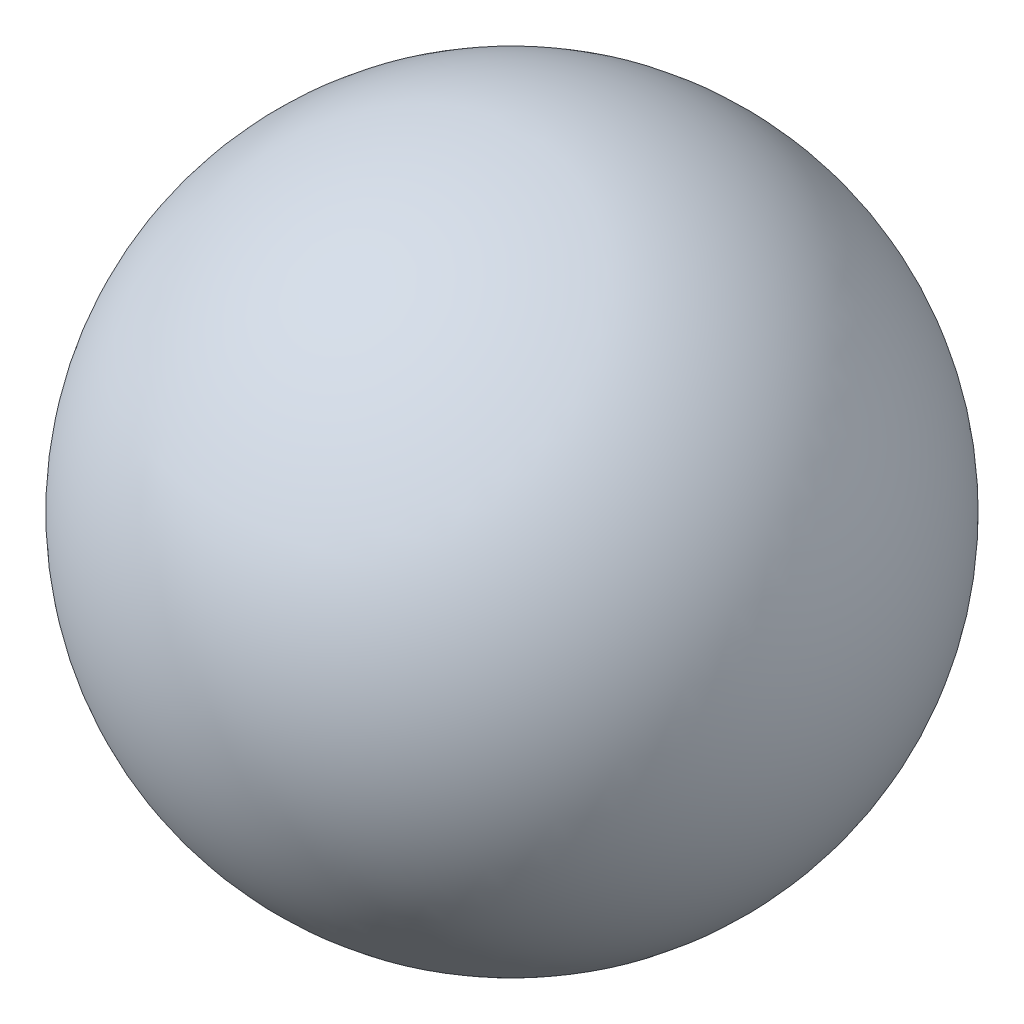
ISO-10303-21;
HEADER;
FILE_DESCRIPTION(('STEP AP214'),'2;1');
FILE_NAME('part.step','',(''),(''),'','','');
FILE_SCHEMA(('AUTOMOTIVE_DESIGN { 1 0 10303 214 1 1 1 1 }'));
ENDSEC;
DATA;
#1=APPLICATION_CONTEXT('core data for automotive mechanical design processes');
#2=APPLICATION_PROTOCOL_DEFINITION('international standard','automotive_design',2000,#1);
#3=PRODUCT_CONTEXT('',#1,'mechanical');
#4=PRODUCT('Part','Part','',(#3));
#5=PRODUCT_RELATED_PRODUCT_CATEGORY('part','',(#4));
#6=PRODUCT_DEFINITION_FORMATION('','',#4);
#7=PRODUCT_DEFINITION_CONTEXT('part definition',#1,'design');
#8=PRODUCT_DEFINITION('design','',#6,#7);
#9=PRODUCT_DEFINITION_SHAPE('','',#8);
#10=(LENGTH_UNIT() NAMED_UNIT(*) SI_UNIT(.MILLI.,.METRE.));
#11=(NAMED_UNIT(*) PLANE_ANGLE_UNIT() SI_UNIT($,.RADIAN.));
#12=(NAMED_UNIT(*) SI_UNIT($,.STERADIAN.) SOLID_ANGLE_UNIT());
#13=UNCERTAINTY_MEASURE_WITH_UNIT(LENGTH_MEASURE(1.E-05),#10,'distance_accuracy_value','');
#14=(GEOMETRIC_REPRESENTATION_CONTEXT(3) GLOBAL_UNCERTAINTY_ASSIGNED_CONTEXT((#13)) GLOBAL_UNIT_ASSIGNED_CONTEXT((#10,
#11,#12)) REPRESENTATION_CONTEXT('',''));
#15=CARTESIAN_POINT('',(0.,0.,0.));
#16=DIRECTION('',(0.,0.,1.));
#17=DIRECTION('',(1.,0.,0.));
#18=AXIS2_PLACEMENT_3D('',#15,#16,#17);
#19=CARTESIAN_POINT('',(69.1749697750399,39.854530462748,2.11749564475551));
#20=DIRECTION('',(0.,-1.,0.));
#21=DIRECTION('',(-1.,0.,0.));
#22=AXIS2_PLACEMENT_3D('',#19,#20,#21);
#23=SPHERICAL_SURFACE('',#22,0.1397);
#24=CARTESIAN_POINT('',(69.1749697750399,39.994230462748,2.11749564475551));
#25=VERTEX_POINT('',#24);
#26=VERTEX_LOOP('',#25);
#27=FACE_BOUND('',#26,.T.);
#28=CARTESIAN_POINT('',(69.1749697750399,39.714830462748,2.11749564475551));
#29=VERTEX_POINT('',#28);
#30=VERTEX_LOOP('',#29);
#31=FACE_BOUND('',#30,.T.);
#32=ADVANCED_FACE('F16',(#27,#31),#23,.T.);
#33=CLOSED_SHELL('',(#32));
#34=MANIFOLD_SOLID_BREP('B1',#33);
#35=ADVANCED_BREP_SHAPE_REPRESENTATION('',(#18,#34),#14);
#36=SHAPE_DEFINITION_REPRESENTATION(#9,#35);
ENDSEC;
END-ISO-10303-21;
